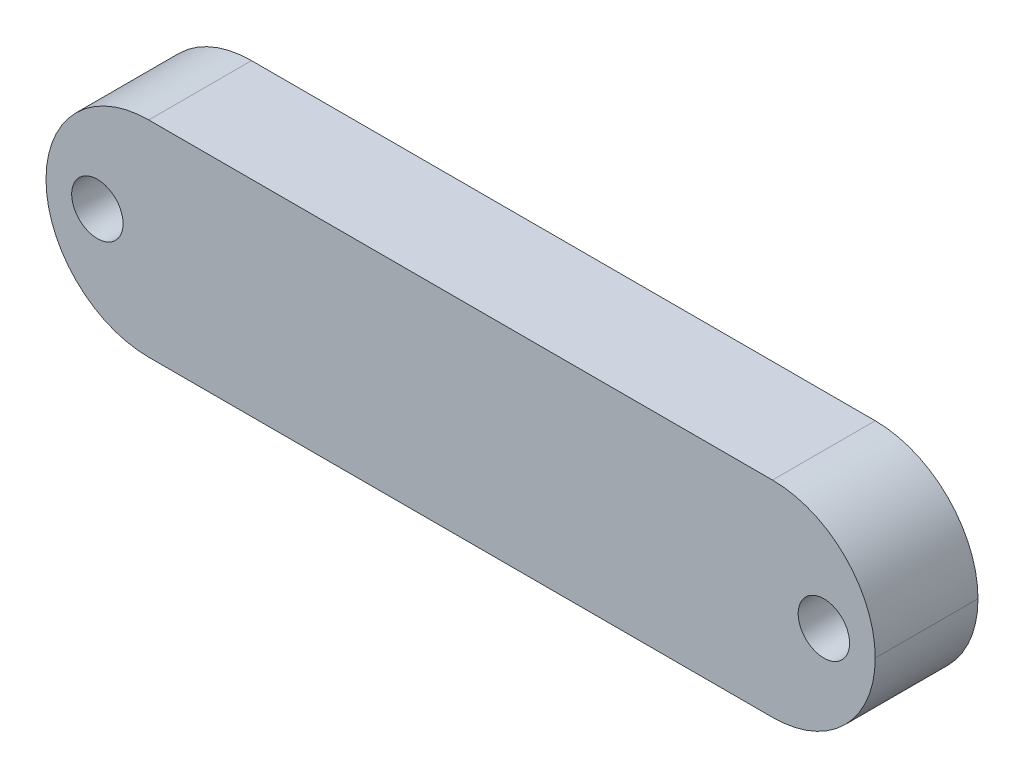
ISO-10303-21;
HEADER;
FILE_DESCRIPTION(('STEP AP214'),'2;1');
FILE_NAME('part.step','',(''),(''),'','','');
FILE_SCHEMA(('AUTOMOTIVE_DESIGN { 1 0 10303 214 1 1 1 1 }'));
ENDSEC;
DATA;
#1=APPLICATION_CONTEXT('core data for automotive mechanical design processes');
#2=APPLICATION_PROTOCOL_DEFINITION('international standard','automotive_design',2000,#1);
#3=PRODUCT_CONTEXT('',#1,'mechanical');
#4=PRODUCT('Part','Part','',(#3));
#5=PRODUCT_RELATED_PRODUCT_CATEGORY('part','',(#4));
#6=PRODUCT_DEFINITION_FORMATION('','',#4);
#7=PRODUCT_DEFINITION_CONTEXT('part definition',#1,'design');
#8=PRODUCT_DEFINITION('design','',#6,#7);
#9=PRODUCT_DEFINITION_SHAPE('','',#8);
#10=(LENGTH_UNIT() NAMED_UNIT(*) SI_UNIT(.MILLI.,.METRE.));
#11=(NAMED_UNIT(*) PLANE_ANGLE_UNIT() SI_UNIT($,.RADIAN.));
#12=(NAMED_UNIT(*) SI_UNIT($,.STERADIAN.) SOLID_ANGLE_UNIT());
#13=UNCERTAINTY_MEASURE_WITH_UNIT(LENGTH_MEASURE(1.E-05),#10,'distance_accuracy_value','');
#14=(GEOMETRIC_REPRESENTATION_CONTEXT(3) GLOBAL_UNCERTAINTY_ASSIGNED_CONTEXT((#13)) GLOBAL_UNIT_ASSIGNED_CONTEXT((#10,
#11,#12)) REPRESENTATION_CONTEXT('',''));
#15=CARTESIAN_POINT('',(0.,0.,0.));
#16=DIRECTION('',(0.,0.,1.));
#17=DIRECTION('',(1.,0.,0.));
#18=AXIS2_PLACEMENT_3D('',#15,#16,#17);
#19=CARTESIAN_POINT('',(0.,0.,10.));
#20=DIRECTION('',(0.,0.,1.));
#21=DIRECTION('',(1.,0.,0.));
#22=AXIS2_PLACEMENT_3D('',#19,#20,#21);
#23=PLANE('',#22);
#24=CARTESIAN_POINT('',(-35.35,0.,10.));
#25=DIRECTION('',(0.,0.,1.));
#26=DIRECTION('',(1.,0.,0.));
#27=AXIS2_PLACEMENT_3D('',#24,#25,#26);
#28=CIRCLE('',#27,2.5);
#29=CARTESIAN_POINT('',(-32.85,0.,10.));
#30=VERTEX_POINT('',#29);
#31=EDGE_CURVE('E136',#30,#30,#28,.T.);
#32=ORIENTED_EDGE('',*,*,#31,.F.);
#33=EDGE_LOOP('',(#32));
#34=FACE_BOUND('',#33,.T.);
#35=DIRECTION('',(1.,0.,0.));
#36=VECTOR('',#35,1.);
#37=CARTESIAN_POINT('',(-40.35,-10.,10.));
#38=LINE('',#37,#36);
#39=CARTESIAN_POINT('',(-30.35,-10.,10.));
#40=VERTEX_POINT('',#39);
#41=CARTESIAN_POINT('',(30.35,-10.,10.));
#42=VERTEX_POINT('',#41);
#43=EDGE_CURVE('E128',#40,#42,#38,.T.);
#44=ORIENTED_EDGE('',*,*,#43,.T.);
#45=CARTESIAN_POINT('',(30.35,0.,10.));
#46=DIRECTION('',(0.,0.,1.));
#47=DIRECTION('',(1.,0.,0.));
#48=AXIS2_PLACEMENT_3D('',#45,#46,#47);
#49=CIRCLE('',#48,10.);
#50=CARTESIAN_POINT('',(40.35,0.,10.));
#51=VERTEX_POINT('',#50);
#52=EDGE_CURVE('E123',#42,#51,#49,.T.);
#53=ORIENTED_EDGE('',*,*,#52,.T.);
#54=CARTESIAN_POINT('',(30.35,0.,10.));
#55=DIRECTION('',(0.,0.,1.));
#56=DIRECTION('',(1.,0.,0.));
#57=AXIS2_PLACEMENT_3D('',#54,#55,#56);
#58=CIRCLE('',#57,10.);
#59=CARTESIAN_POINT('',(30.35,10.,10.));
#60=VERTEX_POINT('',#59);
#61=EDGE_CURVE('E105',#51,#60,#58,.T.);
#62=ORIENTED_EDGE('',*,*,#61,.T.);
#63=DIRECTION('',(-1.,0.,0.));
#64=VECTOR('',#63,1.);
#65=CARTESIAN_POINT('',(-40.35,10.,10.));
#66=LINE('',#65,#64);
#67=CARTESIAN_POINT('',(-30.35,10.,10.));
#68=VERTEX_POINT('',#67);
#69=EDGE_CURVE('E133',#60,#68,#66,.T.);
#70=ORIENTED_EDGE('',*,*,#69,.T.);
#71=CARTESIAN_POINT('',(-30.35,0.,10.));
#72=DIRECTION('',(0.,0.,1.));
#73=DIRECTION('',(1.,0.,0.));
#74=AXIS2_PLACEMENT_3D('',#71,#72,#73);
#75=CIRCLE('',#74,10.);
#76=CARTESIAN_POINT('',(-40.35,0.,10.));
#77=VERTEX_POINT('',#76);
#78=EDGE_CURVE('E50',#68,#77,#75,.T.);
#79=ORIENTED_EDGE('',*,*,#78,.T.);
#80=CARTESIAN_POINT('',(-30.35,0.,10.));
#81=DIRECTION('',(0.,0.,1.));
#82=DIRECTION('',(1.,0.,0.));
#83=AXIS2_PLACEMENT_3D('',#80,#81,#82);
#84=CIRCLE('',#83,10.);
#85=EDGE_CURVE('E120',#77,#40,#84,.T.);
#86=ORIENTED_EDGE('',*,*,#85,.T.);
#87=EDGE_LOOP('',(#44,#53,#62,#70,#79,#86));
#88=FACE_BOUND('',#87,.T.);
#89=CARTESIAN_POINT('',(35.35,0.,10.));
#90=DIRECTION('',(0.,0.,1.));
#91=DIRECTION('',(1.,0.,0.));
#92=AXIS2_PLACEMENT_3D('',#89,#90,#91);
#93=CIRCLE('',#92,2.49999999999999);
#94=CARTESIAN_POINT('',(37.85,0.,10.));
#95=VERTEX_POINT('',#94);
#96=EDGE_CURVE('E184',#95,#95,#93,.T.);
#97=ORIENTED_EDGE('',*,*,#96,.F.);
#98=EDGE_LOOP('',(#97));
#99=FACE_BOUND('',#98,.T.);
#100=ADVANCED_FACE('F33',(#34,#88,#99),#23,.T.);
#101=CARTESIAN_POINT('',(0.,0.,0.));
#102=DIRECTION('',(0.,0.,1.));
#103=DIRECTION('',(1.,0.,0.));
#104=AXIS2_PLACEMENT_3D('',#101,#102,#103);
#105=PLANE('',#104);
#106=CARTESIAN_POINT('',(-35.35,0.,0.));
#107=DIRECTION('',(0.,0.,1.));
#108=DIRECTION('',(1.,0.,0.));
#109=AXIS2_PLACEMENT_3D('',#106,#107,#108);
#110=CIRCLE('',#109,2.5);
#111=CARTESIAN_POINT('',(-32.85,0.,0.));
#112=VERTEX_POINT('',#111);
#113=EDGE_CURVE('E188',#112,#112,#110,.T.);
#114=ORIENTED_EDGE('',*,*,#113,.T.);
#115=EDGE_LOOP('',(#114));
#116=FACE_BOUND('',#115,.T.);
#117=CARTESIAN_POINT('',(30.35,0.,0.));
#118=DIRECTION('',(0.,0.,1.));
#119=DIRECTION('',(1.,0.,0.));
#120=AXIS2_PLACEMENT_3D('',#117,#118,#119);
#121=CIRCLE('',#120,10.);
#122=CARTESIAN_POINT('',(30.35,10.,0.));
#123=VERTEX_POINT('',#122);
#124=CARTESIAN_POINT('',(40.35,0.,0.));
#125=VERTEX_POINT('',#124);
#126=EDGE_CURVE('E88',#123,#125,#121,.F.);
#127=ORIENTED_EDGE('',*,*,#126,.T.);
#128=CARTESIAN_POINT('',(30.35,0.,0.));
#129=DIRECTION('',(0.,0.,1.));
#130=DIRECTION('',(1.,0.,0.));
#131=AXIS2_PLACEMENT_3D('',#128,#129,#130);
#132=CIRCLE('',#131,10.);
#133=CARTESIAN_POINT('',(30.35,-10.,0.));
#134=VERTEX_POINT('',#133);
#135=EDGE_CURVE('E94',#125,#134,#132,.F.);
#136=ORIENTED_EDGE('',*,*,#135,.T.);
#137=DIRECTION('',(1.,0.,0.));
#138=VECTOR('',#137,1.);
#139=CARTESIAN_POINT('',(-40.35,-10.,0.));
#140=LINE('',#139,#138);
#141=CARTESIAN_POINT('',(-30.35,-10.,0.));
#142=VERTEX_POINT('',#141);
#143=EDGE_CURVE('E132',#142,#134,#140,.T.);
#144=ORIENTED_EDGE('',*,*,#143,.F.);
#145=CARTESIAN_POINT('',(-30.35,0.,0.));
#146=DIRECTION('',(0.,0.,1.));
#147=DIRECTION('',(1.,0.,0.));
#148=AXIS2_PLACEMENT_3D('',#145,#146,#147);
#149=CIRCLE('',#148,10.);
#150=CARTESIAN_POINT('',(-40.35,0.,0.));
#151=VERTEX_POINT('',#150);
#152=EDGE_CURVE('E99',#142,#151,#149,.F.);
#153=ORIENTED_EDGE('',*,*,#152,.T.);
#154=CARTESIAN_POINT('',(-30.35,0.,0.));
#155=DIRECTION('',(0.,0.,1.));
#156=DIRECTION('',(1.,0.,0.));
#157=AXIS2_PLACEMENT_3D('',#154,#155,#156);
#158=CIRCLE('',#157,10.);
#159=CARTESIAN_POINT('',(-30.35,10.,0.));
#160=VERTEX_POINT('',#159);
#161=EDGE_CURVE('E140',#151,#160,#158,.F.);
#162=ORIENTED_EDGE('',*,*,#161,.T.);
#163=DIRECTION('',(-1.,0.,0.));
#164=VECTOR('',#163,1.);
#165=CARTESIAN_POINT('',(-40.35,10.,0.));
#166=LINE('',#165,#164);
#167=EDGE_CURVE('E96',#123,#160,#166,.T.);
#168=ORIENTED_EDGE('',*,*,#167,.F.);
#169=EDGE_LOOP('',(#127,#136,#144,#153,#162,#168));
#170=FACE_BOUND('',#169,.T.);
#171=CARTESIAN_POINT('',(35.35,0.,0.));
#172=DIRECTION('',(0.,0.,1.));
#173=DIRECTION('',(1.,0.,0.));
#174=AXIS2_PLACEMENT_3D('',#171,#172,#173);
#175=CIRCLE('',#174,2.49999999999999);
#176=CARTESIAN_POINT('',(37.85,0.,0.));
#177=VERTEX_POINT('',#176);
#178=EDGE_CURVE('E107',#177,#177,#175,.T.);
#179=ORIENTED_EDGE('',*,*,#178,.T.);
#180=EDGE_LOOP('',(#179));
#181=FACE_BOUND('',#180,.T.);
#182=ADVANCED_FACE('F90',(#116,#170,#181),#105,.F.);
#183=CARTESIAN_POINT('',(-40.35,10.,10.));
#184=DIRECTION('',(0.,-1.,0.));
#185=DIRECTION('',(0.,0.,-1.));
#186=AXIS2_PLACEMENT_3D('',#183,#184,#185);
#187=PLANE('',#186);
#188=ORIENTED_EDGE('',*,*,#69,.F.);
#189=DIRECTION('',(0.,0.,-1.));
#190=VECTOR('',#189,1.);
#191=CARTESIAN_POINT('',(30.35,10.,10.));
#192=LINE('',#191,#190);
#193=EDGE_CURVE('E11',#60,#123,#192,.T.);
#194=ORIENTED_EDGE('',*,*,#193,.T.);
#195=ORIENTED_EDGE('',*,*,#167,.T.);
#196=DIRECTION('',(0.,0.,-1.));
#197=VECTOR('',#196,1.);
#198=CARTESIAN_POINT('',(-30.35,10.,10.));
#199=LINE('',#198,#197);
#200=EDGE_CURVE('E42',#160,#68,#199,.F.);
#201=ORIENTED_EDGE('',*,*,#200,.T.);
#202=EDGE_LOOP('',(#188,#194,#195,#201));
#203=FACE_BOUND('',#202,.T.);
#204=ADVANCED_FACE('F158',(#203),#187,.F.);
#205=CARTESIAN_POINT('',(-40.35,-10.,10.));
#206=DIRECTION('',(0.,1.,0.));
#207=DIRECTION('',(-1.,0.,0.));
#208=AXIS2_PLACEMENT_3D('',#205,#206,#207);
#209=PLANE('',#208);
#210=ORIENTED_EDGE('',*,*,#143,.T.);
#211=DIRECTION('',(0.,0.,-1.));
#212=VECTOR('',#211,1.);
#213=CARTESIAN_POINT('',(30.35,-10.,10.));
#214=LINE('',#213,#212);
#215=EDGE_CURVE('E111',#134,#42,#214,.F.);
#216=ORIENTED_EDGE('',*,*,#215,.T.);
#217=ORIENTED_EDGE('',*,*,#43,.F.);
#218=DIRECTION('',(0.,0.,-1.));
#219=VECTOR('',#218,1.);
#220=CARTESIAN_POINT('',(-30.35,-10.,10.));
#221=LINE('',#220,#219);
#222=EDGE_CURVE('E112',#40,#142,#221,.T.);
#223=ORIENTED_EDGE('',*,*,#222,.T.);
#224=EDGE_LOOP('',(#210,#216,#217,#223));
#225=FACE_BOUND('',#224,.T.);
#226=ADVANCED_FACE('F130',(#225),#209,.F.);
#227=CARTESIAN_POINT('',(-35.35,0.,10.));
#228=DIRECTION('',(0.,0.,-1.));
#229=DIRECTION('',(-1.,0.,0.));
#230=AXIS2_PLACEMENT_3D('',#227,#228,#229);
#231=CYLINDRICAL_SURFACE('',#230,2.5);
#232=ORIENTED_EDGE('',*,*,#31,.T.);
#233=EDGE_LOOP('',(#232));
#234=FACE_BOUND('',#233,.T.);
#235=ORIENTED_EDGE('',*,*,#113,.F.);
#236=EDGE_LOOP('',(#235));
#237=FACE_BOUND('',#236,.T.);
#238=ADVANCED_FACE('F163',(#234,#237),#231,.F.);
#239=CARTESIAN_POINT('',(35.35,0.,10.));
#240=DIRECTION('',(0.,0.,-1.));
#241=DIRECTION('',(-1.,0.,0.));
#242=AXIS2_PLACEMENT_3D('',#239,#240,#241);
#243=CYLINDRICAL_SURFACE('',#242,2.49999999999999);
#244=ORIENTED_EDGE('',*,*,#96,.T.);
#245=EDGE_LOOP('',(#244));
#246=FACE_BOUND('',#245,.T.);
#247=ORIENTED_EDGE('',*,*,#178,.F.);
#248=EDGE_LOOP('',(#247));
#249=FACE_BOUND('',#248,.T.);
#250=ADVANCED_FACE('F172',(#246,#249),#243,.F.);
#251=CARTESIAN_POINT('',(30.35,0.,10.));
#252=DIRECTION('',(0.,0.,-1.));
#253=DIRECTION('',(-1.,0.,0.));
#254=AXIS2_PLACEMENT_3D('',#251,#252,#253);
#255=CYLINDRICAL_SURFACE('',#254,10.);
#256=ORIENTED_EDGE('',*,*,#193,.F.);
#257=ORIENTED_EDGE('',*,*,#61,.F.);
#258=DIRECTION('',(0.,0.,-1.));
#259=VECTOR('',#258,1.);
#260=CARTESIAN_POINT('',(40.35,0.,10.));
#261=LINE('',#260,#259);
#262=EDGE_CURVE('E103',#125,#51,#261,.F.);
#263=ORIENTED_EDGE('',*,*,#262,.F.);
#264=ORIENTED_EDGE('',*,*,#126,.F.);
#265=EDGE_LOOP('',(#256,#257,#263,#264));
#266=FACE_BOUND('',#265,.T.);
#267=ADVANCED_FACE('F104',(#266),#255,.T.);
#268=CARTESIAN_POINT('',(30.35,0.,10.));
#269=DIRECTION('',(0.,0.,-1.));
#270=DIRECTION('',(-1.,0.,0.));
#271=AXIS2_PLACEMENT_3D('',#268,#269,#270);
#272=CYLINDRICAL_SURFACE('',#271,10.);
#273=ORIENTED_EDGE('',*,*,#52,.F.);
#274=ORIENTED_EDGE('',*,*,#215,.F.);
#275=ORIENTED_EDGE('',*,*,#135,.F.);
#276=ORIENTED_EDGE('',*,*,#262,.T.);
#277=EDGE_LOOP('',(#273,#274,#275,#276));
#278=FACE_BOUND('',#277,.T.);
#279=ADVANCED_FACE('F109',(#278),#272,.T.);
#280=CARTESIAN_POINT('',(-30.35,0.,10.));
#281=DIRECTION('',(0.,0.,-1.));
#282=DIRECTION('',(-1.,0.,0.));
#283=AXIS2_PLACEMENT_3D('',#280,#281,#282);
#284=CYLINDRICAL_SURFACE('',#283,10.);
#285=DIRECTION('',(0.,0.,-1.));
#286=VECTOR('',#285,1.);
#287=CARTESIAN_POINT('',(-40.35,0.,10.));
#288=LINE('',#287,#286);
#289=EDGE_CURVE('E37',#77,#151,#288,.T.);
#290=ORIENTED_EDGE('',*,*,#289,.F.);
#291=ORIENTED_EDGE('',*,*,#78,.F.);
#292=ORIENTED_EDGE('',*,*,#200,.F.);
#293=ORIENTED_EDGE('',*,*,#161,.F.);
#294=EDGE_LOOP('',(#290,#291,#292,#293));
#295=FACE_BOUND('',#294,.T.);
#296=ADVANCED_FACE('F35',(#295),#284,.T.);
#297=CARTESIAN_POINT('',(-30.35,0.,10.));
#298=DIRECTION('',(0.,0.,-1.));
#299=DIRECTION('',(-1.,0.,0.));
#300=AXIS2_PLACEMENT_3D('',#297,#298,#299);
#301=CYLINDRICAL_SURFACE('',#300,10.);
#302=ORIENTED_EDGE('',*,*,#85,.F.);
#303=ORIENTED_EDGE('',*,*,#289,.T.);
#304=ORIENTED_EDGE('',*,*,#152,.F.);
#305=ORIENTED_EDGE('',*,*,#222,.F.);
#306=EDGE_LOOP('',(#302,#303,#304,#305));
#307=FACE_BOUND('',#306,.T.);
#308=ADVANCED_FACE('F146',(#307),#301,.T.);
#309=CLOSED_SHELL('',(#100,#182,#204,#226,#238,#250,#267,#279,#296,#308));
#310=MANIFOLD_SOLID_BREP('B2',#309);
#311=ADVANCED_BREP_SHAPE_REPRESENTATION('',(#18,#310),#14);
#312=SHAPE_DEFINITION_REPRESENTATION(#9,#311);
ENDSEC;
END-ISO-10303-21;
